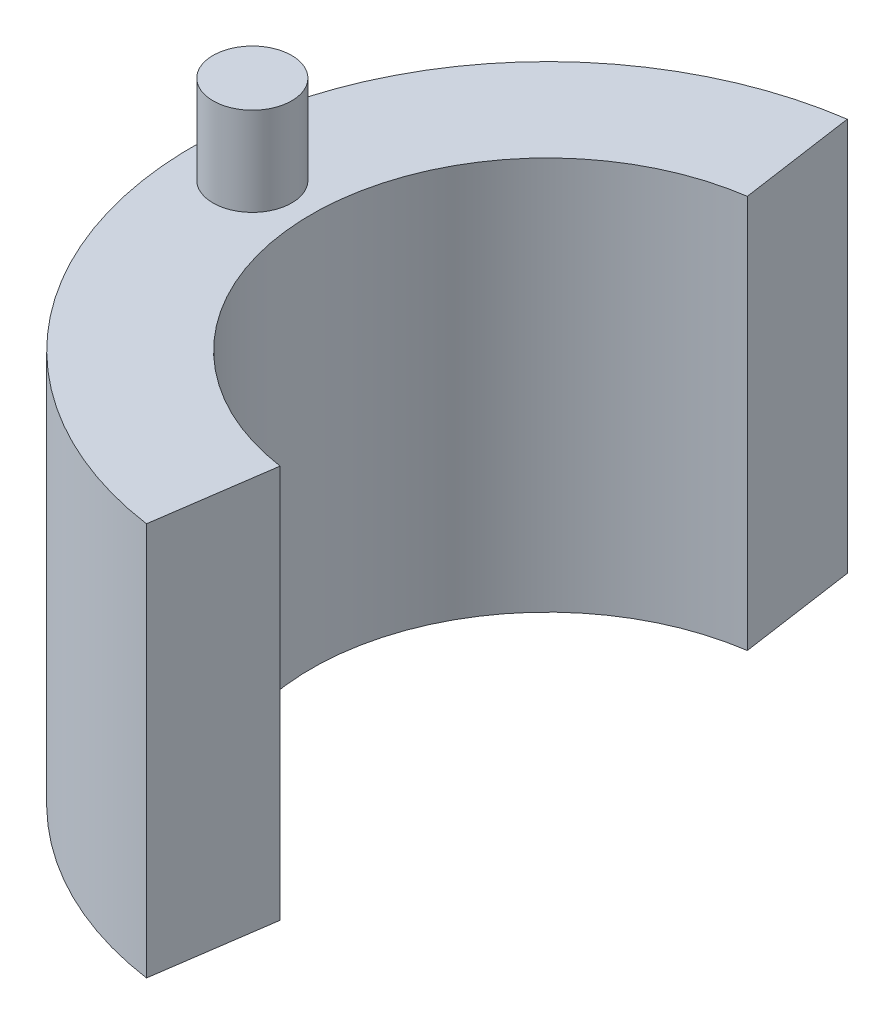
ISO-10303-21;
HEADER;
FILE_DESCRIPTION(('STEP AP214'),'2;1');
FILE_NAME('part.step','',(''),(''),'','','');
FILE_SCHEMA(('AUTOMOTIVE_DESIGN { 1 0 10303 214 1 1 1 1 }'));
ENDSEC;
DATA;
#1=APPLICATION_CONTEXT('core data for automotive mechanical design processes');
#2=APPLICATION_PROTOCOL_DEFINITION('international standard','automotive_design',2000,#1);
#3=PRODUCT_CONTEXT('',#1,'mechanical');
#4=PRODUCT('Part','Part','',(#3));
#5=PRODUCT_RELATED_PRODUCT_CATEGORY('part','',(#4));
#6=PRODUCT_DEFINITION_FORMATION('','',#4);
#7=PRODUCT_DEFINITION_CONTEXT('part definition',#1,'design');
#8=PRODUCT_DEFINITION('design','',#6,#7);
#9=PRODUCT_DEFINITION_SHAPE('','',#8);
#10=(LENGTH_UNIT() NAMED_UNIT(*) SI_UNIT(.MILLI.,.METRE.));
#11=(NAMED_UNIT(*) PLANE_ANGLE_UNIT() SI_UNIT($,.RADIAN.));
#12=(NAMED_UNIT(*) SI_UNIT($,.STERADIAN.) SOLID_ANGLE_UNIT());
#13=UNCERTAINTY_MEASURE_WITH_UNIT(LENGTH_MEASURE(1.E-05),#10,'distance_accuracy_value','');
#14=(GEOMETRIC_REPRESENTATION_CONTEXT(3) GLOBAL_UNCERTAINTY_ASSIGNED_CONTEXT((#13)) GLOBAL_UNIT_ASSIGNED_CONTEXT((#10,
#11,#12)) REPRESENTATION_CONTEXT('',''));
#15=CARTESIAN_POINT('',(0.,0.,0.));
#16=DIRECTION('',(0.,0.,1.));
#17=DIRECTION('',(1.,0.,0.));
#18=AXIS2_PLACEMENT_3D('',#15,#16,#17);
#19=CARTESIAN_POINT('',(0.,10.,0.));
#20=DIRECTION('',(-0.989780261025803,0.,0.142600963824558));
#21=DIRECTION('',(0.142600963824558,0.,0.989780261025803));
#22=AXIS2_PLACEMENT_3D('',#19,#20,#21);
#23=PLANE('',#22);
#24=DIRECTION('',(-0.142600963824558,0.,-0.989780261025803));
#25=VECTOR('',#24,1.);
#26=CARTESIAN_POINT('',(0.,0.,0.));
#27=LINE('',#26,#25);
#28=CARTESIAN_POINT('',(-0.855605782947346,0.,-5.93868156615482));
#29=VERTEX_POINT('',#28);
#30=CARTESIAN_POINT('',(-1.28340867442102,0.,-8.90802234923223));
#31=VERTEX_POINT('',#30);
#32=EDGE_CURVE('E98',#29,#31,#27,.T.);
#33=ORIENTED_EDGE('',*,*,#32,.T.);
#34=DIRECTION('',(0.,-1.,0.));
#35=VECTOR('',#34,1.);
#36=CARTESIAN_POINT('',(-1.28340867442102,10.,-8.90802234923223));
#37=LINE('',#36,#35);
#38=CARTESIAN_POINT('',(-1.28340867442102,10.,-8.90802234923223));
#39=VERTEX_POINT('',#38);
#40=EDGE_CURVE('E11',#39,#31,#37,.T.);
#41=ORIENTED_EDGE('',*,*,#40,.F.);
#42=DIRECTION('',(-0.142600963824558,0.,-0.989780261025803));
#43=VECTOR('',#42,1.);
#44=CARTESIAN_POINT('',(0.,10.,0.));
#45=LINE('',#44,#43);
#46=CARTESIAN_POINT('',(-0.855605782947346,10.,-5.93868156615482));
#47=VERTEX_POINT('',#46);
#48=EDGE_CURVE('E84',#47,#39,#45,.T.);
#49=ORIENTED_EDGE('',*,*,#48,.F.);
#50=DIRECTION('',(0.,-1.,0.));
#51=VECTOR('',#50,1.);
#52=CARTESIAN_POINT('',(-0.855605782947346,10.,-5.93868156615482));
#53=LINE('',#52,#51);
#54=EDGE_CURVE('E51',#47,#29,#53,.T.);
#55=ORIENTED_EDGE('',*,*,#54,.T.);
#56=EDGE_LOOP('',(#33,#41,#49,#55));
#57=FACE_BOUND('',#56,.T.);
#58=ADVANCED_FACE('F35',(#57),#23,.F.);
#59=CARTESIAN_POINT('',(0.,10.,0.));
#60=DIRECTION('',(0.,-1.,0.));
#61=DIRECTION('',(0.,0.,-1.));
#62=AXIS2_PLACEMENT_3D('',#59,#60,#61);
#63=CYLINDRICAL_SURFACE('',#62,9.);
#64=CARTESIAN_POINT('',(0.,0.,0.));
#65=DIRECTION('',(0.,1.,0.));
#66=DIRECTION('',(0.,0.,1.));
#67=AXIS2_PLACEMENT_3D('',#64,#65,#66);
#68=CIRCLE('',#67,9.);
#69=CARTESIAN_POINT('',(-1.28340867442102,0.,8.90802234923223));
#70=VERTEX_POINT('',#69);
#71=EDGE_CURVE('E89',#31,#70,#68,.T.);
#72=ORIENTED_EDGE('',*,*,#71,.T.);
#73=DIRECTION('',(0.,-1.,0.));
#74=VECTOR('',#73,1.);
#75=CARTESIAN_POINT('',(-1.28340867442102,10.,8.90802234923223));
#76=LINE('',#75,#74);
#77=CARTESIAN_POINT('',(-1.28340867442102,10.,8.90802234923223));
#78=VERTEX_POINT('',#77);
#79=EDGE_CURVE('E43',#78,#70,#76,.T.);
#80=ORIENTED_EDGE('',*,*,#79,.F.);
#81=CARTESIAN_POINT('',(0.,10.,0.));
#82=DIRECTION('',(0.,1.,0.));
#83=DIRECTION('',(0.,0.,1.));
#84=AXIS2_PLACEMENT_3D('',#81,#82,#83);
#85=CIRCLE('',#84,9.);
#86=EDGE_CURVE('E76',#39,#78,#85,.T.);
#87=ORIENTED_EDGE('',*,*,#86,.F.);
#88=ORIENTED_EDGE('',*,*,#40,.T.);
#89=EDGE_LOOP('',(#72,#80,#87,#88));
#90=FACE_BOUND('',#89,.T.);
#91=ADVANCED_FACE('F88',(#90),#63,.T.);
#92=CARTESIAN_POINT('',(0.,10.,0.));
#93=DIRECTION('',(0.989780261025803,0.,0.142600963824558));
#94=DIRECTION('',(0.142600963824558,0.,-0.989780261025803));
#95=AXIS2_PLACEMENT_3D('',#92,#93,#94);
#96=PLANE('',#95);
#97=DIRECTION('',(-0.142600963824558,0.,0.989780261025803));
#98=VECTOR('',#97,1.);
#99=CARTESIAN_POINT('',(0.,0.,0.));
#100=LINE('',#99,#98);
#101=CARTESIAN_POINT('',(-0.855605782947346,0.,5.93868156615482));
#102=VERTEX_POINT('',#101);
#103=EDGE_CURVE('E102',#102,#70,#100,.T.);
#104=ORIENTED_EDGE('',*,*,#103,.F.);
#105=DIRECTION('',(0.,-1.,0.));
#106=VECTOR('',#105,1.);
#107=CARTESIAN_POINT('',(-0.855605782947346,10.,5.93868156615482));
#108=LINE('',#107,#106);
#109=CARTESIAN_POINT('',(-0.855605782947346,10.,5.93868156615482));
#110=VERTEX_POINT('',#109);
#111=EDGE_CURVE('E65',#110,#102,#108,.T.);
#112=ORIENTED_EDGE('',*,*,#111,.F.);
#113=DIRECTION('',(-0.142600963824558,0.,0.989780261025803));
#114=VECTOR('',#113,1.);
#115=CARTESIAN_POINT('',(0.,10.,0.));
#116=LINE('',#115,#114);
#117=EDGE_CURVE('E83',#110,#78,#116,.T.);
#118=ORIENTED_EDGE('',*,*,#117,.T.);
#119=ORIENTED_EDGE('',*,*,#79,.T.);
#120=EDGE_LOOP('',(#104,#112,#118,#119));
#121=FACE_BOUND('',#120,.T.);
#122=ADVANCED_FACE('F92',(#121),#96,.T.);
#123=CARTESIAN_POINT('',(0.,10.,0.));
#124=DIRECTION('',(0.,-1.,0.));
#125=DIRECTION('',(0.,0.,-1.));
#126=AXIS2_PLACEMENT_3D('',#123,#124,#125);
#127=CYLINDRICAL_SURFACE('',#126,6.);
#128=CARTESIAN_POINT('',(0.,0.,0.));
#129=DIRECTION('',(0.,1.,0.));
#130=DIRECTION('',(0.,0.,1.));
#131=AXIS2_PLACEMENT_3D('',#128,#129,#130);
#132=CIRCLE('',#131,6.);
#133=EDGE_CURVE('E104',#29,#102,#132,.T.);
#134=ORIENTED_EDGE('',*,*,#133,.F.);
#135=ORIENTED_EDGE('',*,*,#54,.F.);
#136=CARTESIAN_POINT('',(0.,10.,0.));
#137=DIRECTION('',(0.,1.,0.));
#138=DIRECTION('',(0.,0.,1.));
#139=AXIS2_PLACEMENT_3D('',#136,#137,#138);
#140=CIRCLE('',#139,6.);
#141=EDGE_CURVE('E93',#47,#110,#140,.T.);
#142=ORIENTED_EDGE('',*,*,#141,.T.);
#143=ORIENTED_EDGE('',*,*,#111,.T.);
#144=EDGE_LOOP('',(#134,#135,#142,#143));
#145=FACE_BOUND('',#144,.T.);
#146=ADVANCED_FACE('F126',(#145),#127,.F.);
#147=CARTESIAN_POINT('',(0.,10.,0.));
#148=DIRECTION('',(0.,1.,0.));
#149=DIRECTION('',(0.,0.,1.));
#150=AXIS2_PLACEMENT_3D('',#147,#148,#149);
#151=PLANE('',#150);
#152=CARTESIAN_POINT('',(-7.5,10.,0.));
#153=DIRECTION('',(0.,1.,0.));
#154=DIRECTION('',(0.,0.,1.));
#155=AXIS2_PLACEMENT_3D('',#152,#153,#154);
#156=CIRCLE('',#155,1.);
#157=CARTESIAN_POINT('',(-7.5,10.,0.999999999999999));
#158=VERTEX_POINT('',#157);
#159=EDGE_CURVE('E110',#158,#158,#156,.T.);
#160=ORIENTED_EDGE('',*,*,#159,.F.);
#161=EDGE_LOOP('',(#160));
#162=FACE_BOUND('',#161,.T.);
#163=ORIENTED_EDGE('',*,*,#48,.T.);
#164=ORIENTED_EDGE('',*,*,#86,.T.);
#165=ORIENTED_EDGE('',*,*,#117,.F.);
#166=ORIENTED_EDGE('',*,*,#141,.F.);
#167=EDGE_LOOP('',(#163,#164,#165,#166));
#168=FACE_BOUND('',#167,.T.);
#169=ADVANCED_FACE('F80',(#162,#168),#151,.T.);
#170=CARTESIAN_POINT('',(0.,0.,0.));
#171=DIRECTION('',(0.,1.,0.));
#172=DIRECTION('',(0.,0.,1.));
#173=AXIS2_PLACEMENT_3D('',#170,#171,#172);
#174=PLANE('',#173);
#175=ORIENTED_EDGE('',*,*,#32,.F.);
#176=ORIENTED_EDGE('',*,*,#133,.T.);
#177=ORIENTED_EDGE('',*,*,#103,.T.);
#178=ORIENTED_EDGE('',*,*,#71,.F.);
#179=EDGE_LOOP('',(#175,#176,#177,#178));
#180=FACE_BOUND('',#179,.T.);
#181=ADVANCED_FACE('F121',(#180),#174,.F.);
#182=CARTESIAN_POINT('',(-7.5,12.25,0.));
#183=DIRECTION('',(0.,-1.,0.));
#184=DIRECTION('',(0.,0.,-1.));
#185=AXIS2_PLACEMENT_3D('',#182,#183,#184);
#186=CYLINDRICAL_SURFACE('',#185,1.);
#187=CARTESIAN_POINT('',(-7.5,12.25,0.));
#188=DIRECTION('',(0.,1.,0.));
#189=DIRECTION('',(0.,0.,1.));
#190=AXIS2_PLACEMENT_3D('',#187,#188,#189);
#191=CIRCLE('',#190,1.);
#192=CARTESIAN_POINT('',(-7.5,12.25,0.999999999999999));
#193=VERTEX_POINT('',#192);
#194=EDGE_CURVE('E100',#193,#193,#191,.T.);
#195=ORIENTED_EDGE('',*,*,#194,.F.);
#196=EDGE_LOOP('',(#195));
#197=FACE_BOUND('',#196,.T.);
#198=ORIENTED_EDGE('',*,*,#159,.T.);
#199=EDGE_LOOP('',(#198));
#200=FACE_BOUND('',#199,.T.);
#201=ADVANCED_FACE('F118',(#197,#200),#186,.T.);
#202=CARTESIAN_POINT('',(-7.5,12.25,0.));
#203=DIRECTION('',(0.,1.,0.));
#204=DIRECTION('',(0.,0.,1.));
#205=AXIS2_PLACEMENT_3D('',#202,#203,#204);
#206=PLANE('',#205);
#207=ORIENTED_EDGE('',*,*,#194,.T.);
#208=EDGE_LOOP('',(#207));
#209=FACE_BOUND('',#208,.T.);
#210=ADVANCED_FACE('F116',(#209),#206,.T.);
#211=CLOSED_SHELL('',(#58,#91,#122,#146,#169,#181,#201,#210));
#212=MANIFOLD_SOLID_BREP('B2',#211);
#213=ADVANCED_BREP_SHAPE_REPRESENTATION('',(#18,#212),#14);
#214=SHAPE_DEFINITION_REPRESENTATION(#9,#213);
ENDSEC;
END-ISO-10303-21;
